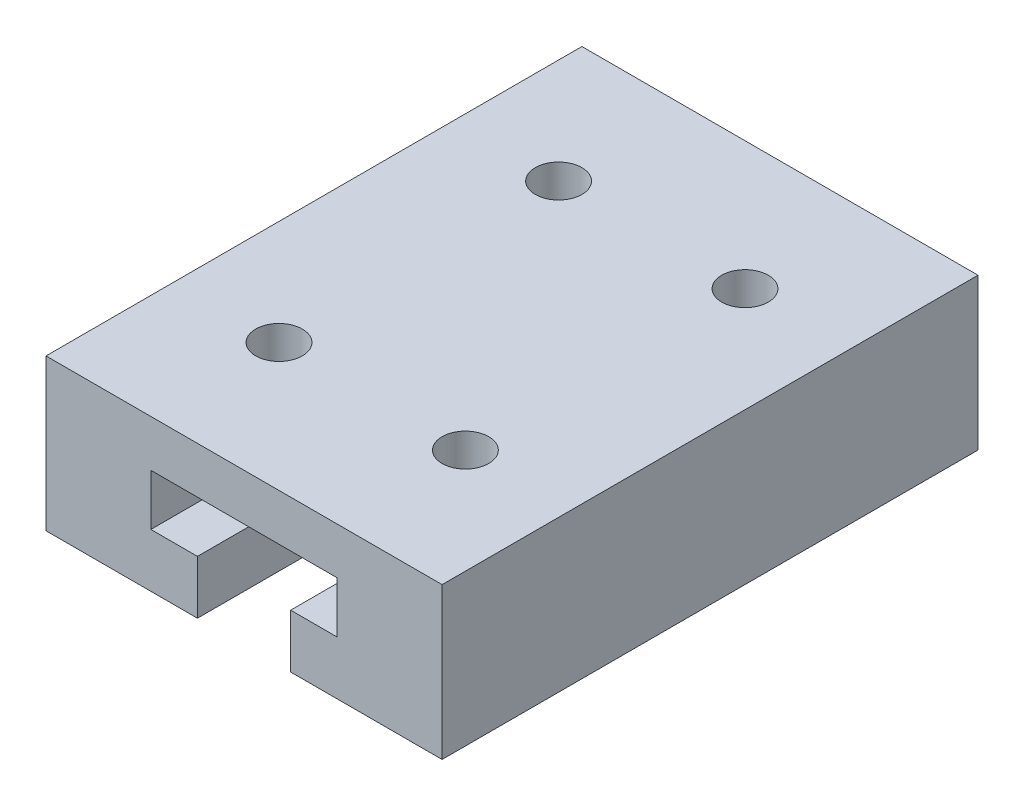
ISO-10303-21;
HEADER;
FILE_DESCRIPTION(('STEP AP214'),'2;1');
FILE_NAME('part.step','',(''),(''),'','','');
FILE_SCHEMA(('AUTOMOTIVE_DESIGN { 1 0 10303 214 1 1 1 1 }'));
ENDSEC;
DATA;
#1=APPLICATION_CONTEXT('core data for automotive mechanical design processes');
#2=APPLICATION_PROTOCOL_DEFINITION('international standard','automotive_design',2000,#1);
#3=PRODUCT_CONTEXT('',#1,'mechanical');
#4=PRODUCT('Part','Part','',(#3));
#5=PRODUCT_RELATED_PRODUCT_CATEGORY('part','',(#4));
#6=PRODUCT_DEFINITION_FORMATION('','',#4);
#7=PRODUCT_DEFINITION_CONTEXT('part definition',#1,'design');
#8=PRODUCT_DEFINITION('design','',#6,#7);
#9=PRODUCT_DEFINITION_SHAPE('','',#8);
#10=(LENGTH_UNIT() NAMED_UNIT(*) SI_UNIT(.MILLI.,.METRE.));
#11=(NAMED_UNIT(*) PLANE_ANGLE_UNIT() SI_UNIT($,.RADIAN.));
#12=(NAMED_UNIT(*) SI_UNIT($,.STERADIAN.) SOLID_ANGLE_UNIT());
#13=UNCERTAINTY_MEASURE_WITH_UNIT(LENGTH_MEASURE(1.E-05),#10,'distance_accuracy_value','');
#14=(GEOMETRIC_REPRESENTATION_CONTEXT(3) GLOBAL_UNCERTAINTY_ASSIGNED_CONTEXT((#13)) GLOBAL_UNIT_ASSIGNED_CONTEXT((#10,
#11,#12)) REPRESENTATION_CONTEXT('',''));
#15=CARTESIAN_POINT('',(0.,0.,0.));
#16=DIRECTION('',(0.,0.,1.));
#17=DIRECTION('',(1.,0.,0.));
#18=AXIS2_PLACEMENT_3D('',#15,#16,#17);
#19=CARTESIAN_POINT('',(-4.,0.,23.));
#20=DIRECTION('',(0.,1.,0.));
#21=DIRECTION('',(0.,0.,1.));
#22=AXIS2_PLACEMENT_3D('',#19,#20,#21);
#23=PLANE('',#22);
#24=DIRECTION('',(1.,0.,0.));
#25=VECTOR('',#24,1.);
#26=CARTESIAN_POINT('',(-4.,0.,0.));
#27=LINE('',#26,#25);
#28=CARTESIAN_POINT('',(-4.,0.,0.));
#29=VERTEX_POINT('',#28);
#30=CARTESIAN_POINT('',(4.,0.,0.));
#31=VERTEX_POINT('',#30);
#32=EDGE_CURVE('E130',#29,#31,#27,.T.);
#33=ORIENTED_EDGE('',*,*,#32,.T.);
#34=DIRECTION('',(0.,0.,-1.));
#35=VECTOR('',#34,1.);
#36=CARTESIAN_POINT('',(4.,0.,23.));
#37=LINE('',#36,#35);
#38=CARTESIAN_POINT('',(4.,0.,23.));
#39=VERTEX_POINT('',#38);
#40=EDGE_CURVE('E134',#39,#31,#37,.T.);
#41=ORIENTED_EDGE('',*,*,#40,.F.);
#42=DIRECTION('',(1.,0.,0.));
#43=VECTOR('',#42,1.);
#44=CARTESIAN_POINT('',(-4.,0.,23.));
#45=LINE('',#44,#43);
#46=CARTESIAN_POINT('',(-4.,0.,23.));
#47=VERTEX_POINT('',#46);
#48=EDGE_CURVE('E143',#47,#39,#45,.T.);
#49=ORIENTED_EDGE('',*,*,#48,.F.);
#50=DIRECTION('',(0.,0.,-1.));
#51=VECTOR('',#50,1.);
#52=CARTESIAN_POINT('',(-4.,0.,23.));
#53=LINE('',#52,#51);
#54=EDGE_CURVE('E126',#47,#29,#53,.T.);
#55=ORIENTED_EDGE('',*,*,#54,.T.);
#56=EDGE_LOOP('',(#33,#41,#49,#55));
#57=FACE_BOUND('',#56,.T.);
#58=ADVANCED_FACE('F41',(#57),#23,.F.);
#59=CARTESIAN_POINT('',(0.,2.,23.));
#60=DIRECTION('',(0.,-1.,0.));
#61=DIRECTION('',(1.,0.,0.));
#62=AXIS2_PLACEMENT_3D('',#59,#60,#61);
#63=PLANE('',#62);
#64=CARTESIAN_POINT('',(-3.99999999999988,2.,17.5));
#65=DIRECTION('',(0.,1.,0.));
#66=DIRECTION('',(-1.,0.,0.));
#67=AXIS2_PLACEMENT_3D('',#64,#65,#66);
#68=CIRCLE('',#67,1.);
#69=CARTESIAN_POINT('',(-4.99999999999988,2.,17.5));
#70=VERTEX_POINT('',#69);
#71=EDGE_CURVE('E397',#70,#70,#68,.T.);
#72=ORIENTED_EDGE('',*,*,#71,.F.);
#73=EDGE_LOOP('',(#72));
#74=FACE_BOUND('',#73,.T.);
#75=CARTESIAN_POINT('',(4.00000000000013,2.,17.5));
#76=DIRECTION('',(0.,1.,0.));
#77=DIRECTION('',(-1.,0.,0.));
#78=AXIS2_PLACEMENT_3D('',#75,#76,#77);
#79=CIRCLE('',#78,1.);
#80=CARTESIAN_POINT('',(3.00000000000012,2.,17.5));
#81=VERTEX_POINT('',#80);
#82=EDGE_CURVE('E416',#81,#81,#79,.T.);
#83=ORIENTED_EDGE('',*,*,#82,.F.);
#84=EDGE_LOOP('',(#83));
#85=FACE_BOUND('',#84,.T.);
#86=CARTESIAN_POINT('',(4.,2.,5.5));
#87=DIRECTION('',(0.,1.,0.));
#88=DIRECTION('',(-1.,0.,0.));
#89=AXIS2_PLACEMENT_3D('',#86,#87,#88);
#90=CIRCLE('',#89,1.);
#91=CARTESIAN_POINT('',(3.,2.,5.5));
#92=VERTEX_POINT('',#91);
#93=EDGE_CURVE('E407',#92,#92,#90,.T.);
#94=ORIENTED_EDGE('',*,*,#93,.F.);
#95=EDGE_LOOP('',(#94));
#96=FACE_BOUND('',#95,.T.);
#97=CARTESIAN_POINT('',(-4.,2.,5.5));
#98=DIRECTION('',(0.,1.,0.));
#99=DIRECTION('',(-1.,0.,0.));
#100=AXIS2_PLACEMENT_3D('',#97,#98,#99);
#101=CIRCLE('',#100,1.);
#102=CARTESIAN_POINT('',(-5.,2.,5.5));
#103=VERTEX_POINT('',#102);
#104=EDGE_CURVE('E405',#103,#103,#101,.T.);
#105=ORIENTED_EDGE('',*,*,#104,.F.);
#106=EDGE_LOOP('',(#105));
#107=FACE_BOUND('',#106,.T.);
#108=DIRECTION('',(-1.,0.,0.));
#109=VECTOR('',#108,1.);
#110=CARTESIAN_POINT('',(0.,2.,0.));
#111=LINE('',#110,#109);
#112=CARTESIAN_POINT('',(8.5,2.,0.));
#113=VERTEX_POINT('',#112);
#114=CARTESIAN_POINT('',(-8.5,2.,0.));
#115=VERTEX_POINT('',#114);
#116=EDGE_CURVE('E133',#113,#115,#111,.T.);
#117=ORIENTED_EDGE('',*,*,#116,.T.);
#118=DIRECTION('',(0.,0.,-1.));
#119=VECTOR('',#118,1.);
#120=CARTESIAN_POINT('',(-8.5,2.,23.));
#121=LINE('',#120,#119);
#122=CARTESIAN_POINT('',(-8.5,2.,23.));
#123=VERTEX_POINT('',#122);
#124=EDGE_CURVE('E11',#123,#115,#121,.T.);
#125=ORIENTED_EDGE('',*,*,#124,.F.);
#126=DIRECTION('',(-1.,0.,0.));
#127=VECTOR('',#126,1.);
#128=CARTESIAN_POINT('',(0.,2.,23.));
#129=LINE('',#128,#127);
#130=CARTESIAN_POINT('',(8.5,2.,23.));
#131=VERTEX_POINT('',#130);
#132=EDGE_CURVE('E95',#131,#123,#129,.T.);
#133=ORIENTED_EDGE('',*,*,#132,.F.);
#134=DIRECTION('',(0.,0.,-1.));
#135=VECTOR('',#134,1.);
#136=CARTESIAN_POINT('',(8.5,2.,23.));
#137=LINE('',#136,#135);
#138=EDGE_CURVE('E191',#131,#113,#137,.T.);
#139=ORIENTED_EDGE('',*,*,#138,.T.);
#140=EDGE_LOOP('',(#117,#125,#133,#139));
#141=FACE_BOUND('',#140,.T.);
#142=ADVANCED_FACE('F188',(#74,#85,#96,#107,#141),#63,.F.);
#143=CARTESIAN_POINT('',(-8.5,2.,23.));
#144=DIRECTION('',(1.,0.,0.));
#145=DIRECTION('',(0.,1.,0.));
#146=AXIS2_PLACEMENT_3D('',#143,#144,#145);
#147=PLANE('',#146);
#148=DIRECTION('',(0.,-1.,0.));
#149=VECTOR('',#148,1.);
#150=CARTESIAN_POINT('',(-8.5,2.,0.));
#151=LINE('',#150,#149);
#152=CARTESIAN_POINT('',(-8.5,-4.5,0.));
#153=VERTEX_POINT('',#152);
#154=EDGE_CURVE('E136',#115,#153,#151,.T.);
#155=ORIENTED_EDGE('',*,*,#154,.T.);
#156=DIRECTION('',(0.,0.,-1.));
#157=VECTOR('',#156,1.);
#158=CARTESIAN_POINT('',(-8.5,-4.5,23.));
#159=LINE('',#158,#157);
#160=CARTESIAN_POINT('',(-8.5,-4.5,23.));
#161=VERTEX_POINT('',#160);
#162=EDGE_CURVE('E49',#161,#153,#159,.T.);
#163=ORIENTED_EDGE('',*,*,#162,.F.);
#164=DIRECTION('',(0.,-1.,0.));
#165=VECTOR('',#164,1.);
#166=CARTESIAN_POINT('',(-8.5,2.,23.));
#167=LINE('',#166,#165);
#168=EDGE_CURVE('E185',#123,#161,#167,.T.);
#169=ORIENTED_EDGE('',*,*,#168,.F.);
#170=ORIENTED_EDGE('',*,*,#124,.T.);
#171=EDGE_LOOP('',(#155,#163,#169,#170));
#172=FACE_BOUND('',#171,.T.);
#173=ADVANCED_FACE('F186',(#172),#147,.F.);
#174=CARTESIAN_POINT('',(-8.5,-4.5,23.));
#175=DIRECTION('',(0.,1.,0.));
#176=DIRECTION('',(0.,0.,1.));
#177=AXIS2_PLACEMENT_3D('',#174,#175,#176);
#178=PLANE('',#177);
#179=DIRECTION('',(1.,0.,0.));
#180=VECTOR('',#179,1.);
#181=CARTESIAN_POINT('',(-8.5,-4.5,0.));
#182=LINE('',#181,#180);
#183=CARTESIAN_POINT('',(-2.,-4.5,0.));
#184=VERTEX_POINT('',#183);
#185=EDGE_CURVE('E138',#153,#184,#182,.T.);
#186=ORIENTED_EDGE('',*,*,#185,.T.);
#187=DIRECTION('',(0.,0.,-1.));
#188=VECTOR('',#187,1.);
#189=CARTESIAN_POINT('',(-2.,-4.5,23.));
#190=LINE('',#189,#188);
#191=CARTESIAN_POINT('',(-2.,-4.5,23.));
#192=VERTEX_POINT('',#191);
#193=EDGE_CURVE('E121',#192,#184,#190,.T.);
#194=ORIENTED_EDGE('',*,*,#193,.F.);
#195=DIRECTION('',(1.,0.,0.));
#196=VECTOR('',#195,1.);
#197=CARTESIAN_POINT('',(-8.5,-4.5,23.));
#198=LINE('',#197,#196);
#199=EDGE_CURVE('E112',#161,#192,#198,.T.);
#200=ORIENTED_EDGE('',*,*,#199,.F.);
#201=ORIENTED_EDGE('',*,*,#162,.T.);
#202=EDGE_LOOP('',(#186,#194,#200,#201));
#203=FACE_BOUND('',#202,.T.);
#204=ADVANCED_FACE('F150',(#203),#178,.F.);
#205=CARTESIAN_POINT('',(-2.,-4.5,23.));
#206=DIRECTION('',(-1.,0.,0.));
#207=DIRECTION('',(0.,0.,1.));
#208=AXIS2_PLACEMENT_3D('',#205,#206,#207);
#209=PLANE('',#208);
#210=DIRECTION('',(0.,1.,0.));
#211=VECTOR('',#210,1.);
#212=CARTESIAN_POINT('',(-2.,-4.5,0.));
#213=LINE('',#212,#211);
#214=CARTESIAN_POINT('',(-2.,-2.2,0.));
#215=VERTEX_POINT('',#214);
#216=EDGE_CURVE('E120',#184,#215,#213,.T.);
#217=ORIENTED_EDGE('',*,*,#216,.T.);
#218=DIRECTION('',(0.,0.,-1.));
#219=VECTOR('',#218,1.);
#220=CARTESIAN_POINT('',(-2.,-2.2,23.));
#221=LINE('',#220,#219);
#222=CARTESIAN_POINT('',(-2.,-2.2,23.));
#223=VERTEX_POINT('',#222);
#224=EDGE_CURVE('E117',#223,#215,#221,.T.);
#225=ORIENTED_EDGE('',*,*,#224,.F.);
#226=DIRECTION('',(0.,1.,0.));
#227=VECTOR('',#226,1.);
#228=CARTESIAN_POINT('',(-2.,-4.5,23.));
#229=LINE('',#228,#227);
#230=EDGE_CURVE('E106',#192,#223,#229,.T.);
#231=ORIENTED_EDGE('',*,*,#230,.F.);
#232=ORIENTED_EDGE('',*,*,#193,.T.);
#233=EDGE_LOOP('',(#217,#225,#231,#232));
#234=FACE_BOUND('',#233,.T.);
#235=ADVANCED_FACE('F118',(#234),#209,.F.);
#236=CARTESIAN_POINT('',(-2.,-2.2,23.));
#237=DIRECTION('',(0.,-1.,0.));
#238=DIRECTION('',(0.,0.,-1.));
#239=AXIS2_PLACEMENT_3D('',#236,#237,#238);
#240=PLANE('',#239);
#241=DIRECTION('',(-1.,0.,0.));
#242=VECTOR('',#241,1.);
#243=CARTESIAN_POINT('',(-2.,-2.2,0.));
#244=LINE('',#243,#242);
#245=CARTESIAN_POINT('',(-4.,-2.2,0.));
#246=VERTEX_POINT('',#245);
#247=EDGE_CURVE('E81',#215,#246,#244,.T.);
#248=ORIENTED_EDGE('',*,*,#247,.T.);
#249=DIRECTION('',(0.,0.,-1.));
#250=VECTOR('',#249,1.);
#251=CARTESIAN_POINT('',(-4.,-2.2,23.));
#252=LINE('',#251,#250);
#253=CARTESIAN_POINT('',(-4.,-2.2,23.));
#254=VERTEX_POINT('',#253);
#255=EDGE_CURVE('E122',#254,#246,#252,.T.);
#256=ORIENTED_EDGE('',*,*,#255,.F.);
#257=DIRECTION('',(-1.,0.,0.));
#258=VECTOR('',#257,1.);
#259=CARTESIAN_POINT('',(-2.,-2.2,23.));
#260=LINE('',#259,#258);
#261=EDGE_CURVE('E110',#223,#254,#260,.T.);
#262=ORIENTED_EDGE('',*,*,#261,.F.);
#263=ORIENTED_EDGE('',*,*,#224,.T.);
#264=EDGE_LOOP('',(#248,#256,#262,#263));
#265=FACE_BOUND('',#264,.T.);
#266=ADVANCED_FACE('F124',(#265),#240,.F.);
#267=CARTESIAN_POINT('',(-4.,-2.2,23.));
#268=DIRECTION('',(-1.,0.,0.));
#269=DIRECTION('',(0.,0.,1.));
#270=AXIS2_PLACEMENT_3D('',#267,#268,#269);
#271=PLANE('',#270);
#272=DIRECTION('',(0.,1.,0.));
#273=VECTOR('',#272,1.);
#274=CARTESIAN_POINT('',(-4.,-2.2,0.));
#275=LINE('',#274,#273);
#276=EDGE_CURVE('E87',#246,#29,#275,.T.);
#277=ORIENTED_EDGE('',*,*,#276,.T.);
#278=ORIENTED_EDGE('',*,*,#54,.F.);
#279=DIRECTION('',(0.,1.,0.));
#280=VECTOR('',#279,1.);
#281=CARTESIAN_POINT('',(-4.,-2.2,23.));
#282=LINE('',#281,#280);
#283=EDGE_CURVE('E57',#254,#47,#282,.T.);
#284=ORIENTED_EDGE('',*,*,#283,.F.);
#285=ORIENTED_EDGE('',*,*,#255,.T.);
#286=EDGE_LOOP('',(#277,#278,#284,#285));
#287=FACE_BOUND('',#286,.T.);
#288=ADVANCED_FACE('F292',(#287),#271,.F.);
#289=CARTESIAN_POINT('',(0.,0.,23.));
#290=DIRECTION('',(0.,0.,1.));
#291=DIRECTION('',(1.,0.,0.));
#292=AXIS2_PLACEMENT_3D('',#289,#290,#291);
#293=PLANE('',#292);
#294=ORIENTED_EDGE('',*,*,#48,.T.);
#295=DIRECTION('',(0.,1.,0.));
#296=VECTOR('',#295,1.);
#297=CARTESIAN_POINT('',(4.,-2.2,23.));
#298=LINE('',#297,#296);
#299=CARTESIAN_POINT('',(4.,-2.2,23.));
#300=VERTEX_POINT('',#299);
#301=EDGE_CURVE('E175',#300,#39,#298,.T.);
#302=ORIENTED_EDGE('',*,*,#301,.F.);
#303=DIRECTION('',(1.,0.,0.));
#304=VECTOR('',#303,1.);
#305=CARTESIAN_POINT('',(2.,-2.2,23.));
#306=LINE('',#305,#304);
#307=CARTESIAN_POINT('',(2.,-2.2,23.));
#308=VERTEX_POINT('',#307);
#309=EDGE_CURVE('E227',#308,#300,#306,.T.);
#310=ORIENTED_EDGE('',*,*,#309,.F.);
#311=DIRECTION('',(0.,1.,0.));
#312=VECTOR('',#311,1.);
#313=CARTESIAN_POINT('',(2.,-4.5,23.));
#314=LINE('',#313,#312);
#315=CARTESIAN_POINT('',(2.,-4.5,23.));
#316=VERTEX_POINT('',#315);
#317=EDGE_CURVE('E231',#316,#308,#314,.T.);
#318=ORIENTED_EDGE('',*,*,#317,.F.);
#319=DIRECTION('',(-1.,0.,0.));
#320=VECTOR('',#319,1.);
#321=CARTESIAN_POINT('',(8.5,-4.5,23.));
#322=LINE('',#321,#320);
#323=CARTESIAN_POINT('',(8.5,-4.5,23.));
#324=VERTEX_POINT('',#323);
#325=EDGE_CURVE('E233',#324,#316,#322,.T.);
#326=ORIENTED_EDGE('',*,*,#325,.F.);
#327=DIRECTION('',(0.,-1.,0.));
#328=VECTOR('',#327,1.);
#329=CARTESIAN_POINT('',(8.5,2.,23.));
#330=LINE('',#329,#328);
#331=EDGE_CURVE('E239',#131,#324,#330,.T.);
#332=ORIENTED_EDGE('',*,*,#331,.F.);
#333=ORIENTED_EDGE('',*,*,#132,.T.);
#334=ORIENTED_EDGE('',*,*,#168,.T.);
#335=ORIENTED_EDGE('',*,*,#199,.T.);
#336=ORIENTED_EDGE('',*,*,#230,.T.);
#337=ORIENTED_EDGE('',*,*,#261,.T.);
#338=ORIENTED_EDGE('',*,*,#283,.T.);
#339=EDGE_LOOP('',(#294,#302,#310,#318,#326,#332,#333,#334,#335,#336,#337,#338));
#340=FACE_BOUND('',#339,.T.);
#341=ADVANCED_FACE('F108',(#340),#293,.T.);
#342=CARTESIAN_POINT('',(0.,0.,0.));
#343=DIRECTION('',(0.,0.,1.));
#344=DIRECTION('',(1.,0.,0.));
#345=AXIS2_PLACEMENT_3D('',#342,#343,#344);
#346=PLANE('',#345);
#347=ORIENTED_EDGE('',*,*,#32,.F.);
#348=ORIENTED_EDGE('',*,*,#276,.F.);
#349=ORIENTED_EDGE('',*,*,#247,.F.);
#350=ORIENTED_EDGE('',*,*,#216,.F.);
#351=ORIENTED_EDGE('',*,*,#185,.F.);
#352=ORIENTED_EDGE('',*,*,#154,.F.);
#353=ORIENTED_EDGE('',*,*,#116,.F.);
#354=DIRECTION('',(0.,-1.,0.));
#355=VECTOR('',#354,1.);
#356=CARTESIAN_POINT('',(8.5,2.,0.));
#357=LINE('',#356,#355);
#358=CARTESIAN_POINT('',(8.5,-4.5,0.));
#359=VERTEX_POINT('',#358);
#360=EDGE_CURVE('E196',#113,#359,#357,.T.);
#361=ORIENTED_EDGE('',*,*,#360,.T.);
#362=DIRECTION('',(-1.,0.,0.));
#363=VECTOR('',#362,1.);
#364=CARTESIAN_POINT('',(8.5,-4.5,0.));
#365=LINE('',#364,#363);
#366=CARTESIAN_POINT('',(2.,-4.5,0.));
#367=VERTEX_POINT('',#366);
#368=EDGE_CURVE('E248',#359,#367,#365,.T.);
#369=ORIENTED_EDGE('',*,*,#368,.T.);
#370=DIRECTION('',(0.,1.,0.));
#371=VECTOR('',#370,1.);
#372=CARTESIAN_POINT('',(2.,-4.5,0.));
#373=LINE('',#372,#371);
#374=CARTESIAN_POINT('',(2.,-2.2,0.));
#375=VERTEX_POINT('',#374);
#376=EDGE_CURVE('E245',#367,#375,#373,.T.);
#377=ORIENTED_EDGE('',*,*,#376,.T.);
#378=DIRECTION('',(1.,0.,0.));
#379=VECTOR('',#378,1.);
#380=CARTESIAN_POINT('',(2.,-2.2,0.));
#381=LINE('',#380,#379);
#382=CARTESIAN_POINT('',(4.,-2.2,0.));
#383=VERTEX_POINT('',#382);
#384=EDGE_CURVE('E242',#375,#383,#381,.T.);
#385=ORIENTED_EDGE('',*,*,#384,.T.);
#386=DIRECTION('',(0.,1.,0.));
#387=VECTOR('',#386,1.);
#388=CARTESIAN_POINT('',(4.,-2.2,0.));
#389=LINE('',#388,#387);
#390=EDGE_CURVE('E162',#383,#31,#389,.T.);
#391=ORIENTED_EDGE('',*,*,#390,.T.);
#392=EDGE_LOOP('',(#347,#348,#349,#350,#351,#352,#353,#361,#369,#377,#385,#391));
#393=FACE_BOUND('',#392,.T.);
#394=ADVANCED_FACE('F156',(#393),#346,.F.);
#395=CARTESIAN_POINT('',(4.,-2.2,23.));
#396=DIRECTION('',(-1.,0.,0.));
#397=DIRECTION('',(0.,0.,1.));
#398=AXIS2_PLACEMENT_3D('',#395,#396,#397);
#399=PLANE('',#398);
#400=ORIENTED_EDGE('',*,*,#390,.F.);
#401=DIRECTION('',(0.,0.,-1.));
#402=VECTOR('',#401,1.);
#403=CARTESIAN_POINT('',(4.,-2.2,23.));
#404=LINE('',#403,#402);
#405=EDGE_CURVE('E176',#300,#383,#404,.T.);
#406=ORIENTED_EDGE('',*,*,#405,.F.);
#407=ORIENTED_EDGE('',*,*,#301,.T.);
#408=ORIENTED_EDGE('',*,*,#40,.T.);
#409=EDGE_LOOP('',(#400,#406,#407,#408));
#410=FACE_BOUND('',#409,.T.);
#411=ADVANCED_FACE('F172',(#410),#399,.T.);
#412=CARTESIAN_POINT('',(2.,-2.2,23.));
#413=DIRECTION('',(0.,1.,0.));
#414=DIRECTION('',(0.,0.,1.));
#415=AXIS2_PLACEMENT_3D('',#412,#413,#414);
#416=PLANE('',#415);
#417=ORIENTED_EDGE('',*,*,#384,.F.);
#418=DIRECTION('',(0.,0.,-1.));
#419=VECTOR('',#418,1.);
#420=CARTESIAN_POINT('',(2.,-2.2,23.));
#421=LINE('',#420,#419);
#422=EDGE_CURVE('E179',#308,#375,#421,.T.);
#423=ORIENTED_EDGE('',*,*,#422,.F.);
#424=ORIENTED_EDGE('',*,*,#309,.T.);
#425=ORIENTED_EDGE('',*,*,#405,.T.);
#426=EDGE_LOOP('',(#417,#423,#424,#425));
#427=FACE_BOUND('',#426,.T.);
#428=ADVANCED_FACE('F230',(#427),#416,.T.);
#429=CARTESIAN_POINT('',(2.,-4.5,23.));
#430=DIRECTION('',(-1.,0.,0.));
#431=DIRECTION('',(0.,0.,1.));
#432=AXIS2_PLACEMENT_3D('',#429,#430,#431);
#433=PLANE('',#432);
#434=ORIENTED_EDGE('',*,*,#376,.F.);
#435=DIRECTION('',(0.,0.,-1.));
#436=VECTOR('',#435,1.);
#437=CARTESIAN_POINT('',(2.,-4.5,23.));
#438=LINE('',#437,#436);
#439=EDGE_CURVE('E253',#316,#367,#438,.T.);
#440=ORIENTED_EDGE('',*,*,#439,.F.);
#441=ORIENTED_EDGE('',*,*,#317,.T.);
#442=ORIENTED_EDGE('',*,*,#422,.T.);
#443=EDGE_LOOP('',(#434,#440,#441,#442));
#444=FACE_BOUND('',#443,.T.);
#445=ADVANCED_FACE('F256',(#444),#433,.T.);
#446=CARTESIAN_POINT('',(8.5,-4.5,23.));
#447=DIRECTION('',(0.,-1.,0.));
#448=DIRECTION('',(0.,0.,-1.));
#449=AXIS2_PLACEMENT_3D('',#446,#447,#448);
#450=PLANE('',#449);
#451=ORIENTED_EDGE('',*,*,#368,.F.);
#452=DIRECTION('',(0.,0.,-1.));
#453=VECTOR('',#452,1.);
#454=CARTESIAN_POINT('',(8.5,-4.5,23.));
#455=LINE('',#454,#453);
#456=EDGE_CURVE('E204',#324,#359,#455,.T.);
#457=ORIENTED_EDGE('',*,*,#456,.F.);
#458=ORIENTED_EDGE('',*,*,#325,.T.);
#459=ORIENTED_EDGE('',*,*,#439,.T.);
#460=EDGE_LOOP('',(#451,#457,#458,#459));
#461=FACE_BOUND('',#460,.T.);
#462=ADVANCED_FACE('F258',(#461),#450,.T.);
#463=CARTESIAN_POINT('',(8.5,2.,23.));
#464=DIRECTION('',(1.,0.,0.));
#465=DIRECTION('',(0.,1.,0.));
#466=AXIS2_PLACEMENT_3D('',#463,#464,#465);
#467=PLANE('',#466);
#468=ORIENTED_EDGE('',*,*,#360,.F.);
#469=ORIENTED_EDGE('',*,*,#138,.F.);
#470=ORIENTED_EDGE('',*,*,#331,.T.);
#471=ORIENTED_EDGE('',*,*,#456,.T.);
#472=EDGE_LOOP('',(#468,#469,#470,#471));
#473=FACE_BOUND('',#472,.T.);
#474=ADVANCED_FACE('F260',(#473),#467,.T.);
#475=CARTESIAN_POINT('',(-4.,0.5,5.5));
#476=DIRECTION('',(0.,1.,0.));
#477=DIRECTION('',(-1.,0.,0.));
#478=AXIS2_PLACEMENT_3D('',#475,#476,#477);
#479=CYLINDRICAL_SURFACE('',#478,1.);
#480=CARTESIAN_POINT('',(-4.,0.5,5.5));
#481=DIRECTION('',(0.,1.,0.));
#482=DIRECTION('',(-1.,0.,0.));
#483=AXIS2_PLACEMENT_3D('',#480,#481,#482);
#484=CIRCLE('',#483,1.);
#485=CARTESIAN_POINT('',(-5.,0.499999999999999,5.5));
#486=VERTEX_POINT('',#485);
#487=EDGE_CURVE('E243',#486,#486,#484,.T.);
#488=ORIENTED_EDGE('',*,*,#487,.F.);
#489=EDGE_LOOP('',(#488));
#490=FACE_BOUND('',#489,.T.);
#491=ORIENTED_EDGE('',*,*,#104,.T.);
#492=EDGE_LOOP('',(#491));
#493=FACE_BOUND('',#492,.T.);
#494=ADVANCED_FACE('F262',(#490,#493),#479,.F.);
#495=CARTESIAN_POINT('',(-4.,0.5,5.5));
#496=DIRECTION('',(0.,1.,0.));
#497=DIRECTION('',(-1.,0.,0.));
#498=AXIS2_PLACEMENT_3D('',#495,#496,#497);
#499=PLANE('',#498);
#500=ORIENTED_EDGE('',*,*,#487,.T.);
#501=EDGE_LOOP('',(#500));
#502=FACE_BOUND('',#501,.T.);
#503=ADVANCED_FACE('F269',(#502),#499,.T.);
#504=CARTESIAN_POINT('',(4.,0.5,5.5));
#505=DIRECTION('',(0.,1.,0.));
#506=DIRECTION('',(-1.,0.,0.));
#507=AXIS2_PLACEMENT_3D('',#504,#505,#506);
#508=CYLINDRICAL_SURFACE('',#507,1.);
#509=CARTESIAN_POINT('',(4.,0.5,5.5));
#510=DIRECTION('',(0.,1.,0.));
#511=DIRECTION('',(-1.,0.,0.));
#512=AXIS2_PLACEMENT_3D('',#509,#510,#511);
#513=CIRCLE('',#512,1.);
#514=CARTESIAN_POINT('',(3.,0.5,5.5));
#515=VERTEX_POINT('',#514);
#516=EDGE_CURVE('E411',#515,#515,#513,.T.);
#517=ORIENTED_EDGE('',*,*,#516,.F.);
#518=EDGE_LOOP('',(#517));
#519=FACE_BOUND('',#518,.T.);
#520=ORIENTED_EDGE('',*,*,#93,.T.);
#521=EDGE_LOOP('',(#520));
#522=FACE_BOUND('',#521,.T.);
#523=ADVANCED_FACE('F331',(#519,#522),#508,.F.);
#524=CARTESIAN_POINT('',(4.,0.5,5.5));
#525=DIRECTION('',(0.,1.,0.));
#526=DIRECTION('',(-1.,0.,0.));
#527=AXIS2_PLACEMENT_3D('',#524,#525,#526);
#528=PLANE('',#527);
#529=ORIENTED_EDGE('',*,*,#516,.T.);
#530=EDGE_LOOP('',(#529));
#531=FACE_BOUND('',#530,.T.);
#532=ADVANCED_FACE('F341',(#531),#528,.T.);
#533=CARTESIAN_POINT('',(4.00000000000013,0.5,17.5));
#534=DIRECTION('',(0.,1.,0.));
#535=DIRECTION('',(-1.,0.,0.));
#536=AXIS2_PLACEMENT_3D('',#533,#534,#535);
#537=CYLINDRICAL_SURFACE('',#536,1.);
#538=CARTESIAN_POINT('',(4.00000000000013,0.5,17.5));
#539=DIRECTION('',(0.,1.,0.));
#540=DIRECTION('',(-1.,0.,0.));
#541=AXIS2_PLACEMENT_3D('',#538,#539,#540);
#542=CIRCLE('',#541,1.);
#543=CARTESIAN_POINT('',(3.00000000000012,0.5,17.5));
#544=VERTEX_POINT('',#543);
#545=EDGE_CURVE('E400',#544,#544,#542,.T.);
#546=ORIENTED_EDGE('',*,*,#545,.F.);
#547=EDGE_LOOP('',(#546));
#548=FACE_BOUND('',#547,.T.);
#549=ORIENTED_EDGE('',*,*,#82,.T.);
#550=EDGE_LOOP('',(#549));
#551=FACE_BOUND('',#550,.T.);
#552=ADVANCED_FACE('F351',(#548,#551),#537,.F.);
#553=CARTESIAN_POINT('',(4.00000000000013,0.5,17.5));
#554=DIRECTION('',(0.,1.,0.));
#555=DIRECTION('',(-1.,0.,0.));
#556=AXIS2_PLACEMENT_3D('',#553,#554,#555);
#557=PLANE('',#556);
#558=ORIENTED_EDGE('',*,*,#545,.T.);
#559=EDGE_LOOP('',(#558));
#560=FACE_BOUND('',#559,.T.);
#561=ADVANCED_FACE('F361',(#560),#557,.T.);
#562=CARTESIAN_POINT('',(-3.99999999999988,0.5,17.5));
#563=DIRECTION('',(0.,1.,0.));
#564=DIRECTION('',(-1.,0.,0.));
#565=AXIS2_PLACEMENT_3D('',#562,#563,#564);
#566=CYLINDRICAL_SURFACE('',#565,1.);
#567=CARTESIAN_POINT('',(-3.99999999999988,0.5,17.5));
#568=DIRECTION('',(0.,1.,0.));
#569=DIRECTION('',(-1.,0.,0.));
#570=AXIS2_PLACEMENT_3D('',#567,#568,#569);
#571=CIRCLE('',#570,1.);
#572=CARTESIAN_POINT('',(-4.99999999999988,0.499999999999999,17.5));
#573=VERTEX_POINT('',#572);
#574=EDGE_CURVE('E396',#573,#573,#571,.T.);
#575=ORIENTED_EDGE('',*,*,#574,.F.);
#576=EDGE_LOOP('',(#575));
#577=FACE_BOUND('',#576,.T.);
#578=ORIENTED_EDGE('',*,*,#71,.T.);
#579=EDGE_LOOP('',(#578));
#580=FACE_BOUND('',#579,.T.);
#581=ADVANCED_FACE('F371',(#577,#580),#566,.F.);
#582=CARTESIAN_POINT('',(-3.99999999999988,0.5,17.5));
#583=DIRECTION('',(0.,1.,0.));
#584=DIRECTION('',(-1.,0.,0.));
#585=AXIS2_PLACEMENT_3D('',#582,#583,#584);
#586=PLANE('',#585);
#587=ORIENTED_EDGE('',*,*,#574,.T.);
#588=EDGE_LOOP('',(#587));
#589=FACE_BOUND('',#588,.T.);
#590=ADVANCED_FACE('F381',(#589),#586,.T.);
#591=CLOSED_SHELL('',(#58,#142,#173,#204,#235,#266,#288,#341,#394,#411,#428,#445,#462,#474,#494,
#503,#523,#532,#552,#561,#581,#590));
#592=MANIFOLD_SOLID_BREP('B2',#591);
#593=ADVANCED_BREP_SHAPE_REPRESENTATION('',(#18,#592),#14);
#594=SHAPE_DEFINITION_REPRESENTATION(#9,#593);
ENDSEC;
END-ISO-10303-21;
